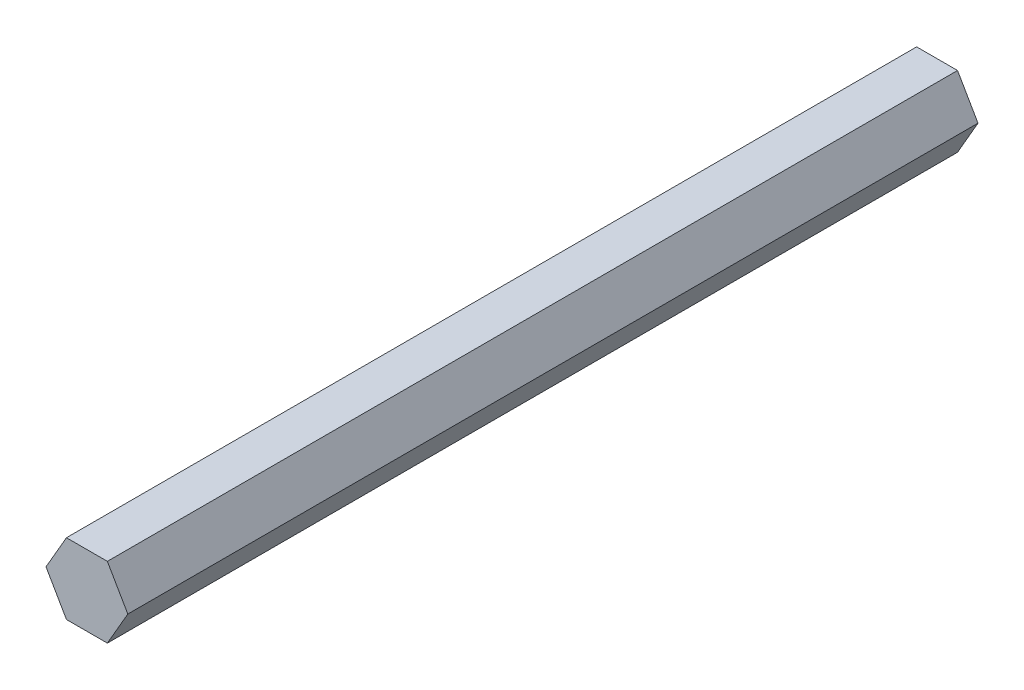
ISO-10303-21;
HEADER;
FILE_DESCRIPTION(('STEP AP214'),'2;1');
FILE_NAME('part.step','',(''),(''),'','','');
FILE_SCHEMA(('AUTOMOTIVE_DESIGN { 1 0 10303 214 1 1 1 1 }'));
ENDSEC;
DATA;
#1=APPLICATION_CONTEXT('core data for automotive mechanical design processes');
#2=APPLICATION_PROTOCOL_DEFINITION('international standard','automotive_design',2000,#1);
#3=PRODUCT_CONTEXT('',#1,'mechanical');
#4=PRODUCT('Part','Part','',(#3));
#5=PRODUCT_RELATED_PRODUCT_CATEGORY('part','',(#4));
#6=PRODUCT_DEFINITION_FORMATION('','',#4);
#7=PRODUCT_DEFINITION_CONTEXT('part definition',#1,'design');
#8=PRODUCT_DEFINITION('design','',#6,#7);
#9=PRODUCT_DEFINITION_SHAPE('','',#8);
#10=(LENGTH_UNIT() NAMED_UNIT(*) SI_UNIT(.MILLI.,.METRE.));
#11=(NAMED_UNIT(*) PLANE_ANGLE_UNIT() SI_UNIT($,.RADIAN.));
#12=(NAMED_UNIT(*) SI_UNIT($,.STERADIAN.) SOLID_ANGLE_UNIT());
#13=UNCERTAINTY_MEASURE_WITH_UNIT(LENGTH_MEASURE(1.E-05),#10,'distance_accuracy_value','');
#14=(GEOMETRIC_REPRESENTATION_CONTEXT(3) GLOBAL_UNCERTAINTY_ASSIGNED_CONTEXT((#13)) GLOBAL_UNIT_ASSIGNED_CONTEXT((#10,
#11,#12)) REPRESENTATION_CONTEXT('',''));
#15=CARTESIAN_POINT('',(0.,0.,0.));
#16=DIRECTION('',(0.,0.,1.));
#17=DIRECTION('',(1.,0.,0.));
#18=AXIS2_PLACEMENT_3D('',#15,#16,#17);
#19=CARTESIAN_POINT('',(-3.66617420935412,-6.35,76.2));
#20=DIRECTION('',(0.,1.,0.));
#21=DIRECTION('',(0.,0.,1.));
#22=AXIS2_PLACEMENT_3D('',#19,#20,#21);
#23=PLANE('',#22);
#24=DIRECTION('',(1.,0.,0.));
#25=VECTOR('',#24,1.);
#26=CARTESIAN_POINT('',(-3.66617420935412,-6.35,-76.2));
#27=LINE('',#26,#25);
#28=CARTESIAN_POINT('',(-3.66617420935412,-6.35,-76.2));
#29=VERTEX_POINT('',#28);
#30=CARTESIAN_POINT('',(3.66617420935412,-6.35,-76.2));
#31=VERTEX_POINT('',#30);
#32=EDGE_CURVE('E121',#29,#31,#27,.T.);
#33=ORIENTED_EDGE('',*,*,#32,.T.);
#34=DIRECTION('',(0.,0.,-1.));
#35=VECTOR('',#34,1.);
#36=CARTESIAN_POINT('',(3.66617420935412,-6.35,76.2));
#37=LINE('',#36,#35);
#38=CARTESIAN_POINT('',(3.66617420935412,-6.35,76.2));
#39=VERTEX_POINT('',#38);
#40=EDGE_CURVE('E11',#39,#31,#37,.T.);
#41=ORIENTED_EDGE('',*,*,#40,.F.);
#42=DIRECTION('',(1.,0.,0.));
#43=VECTOR('',#42,1.);
#44=CARTESIAN_POINT('',(-3.66617420935412,-6.35,76.2));
#45=LINE('',#44,#43);
#46=CARTESIAN_POINT('',(-3.66617420935412,-6.35,76.2));
#47=VERTEX_POINT('',#46);
#48=EDGE_CURVE('E131',#47,#39,#45,.T.);
#49=ORIENTED_EDGE('',*,*,#48,.F.);
#50=DIRECTION('',(0.,0.,-1.));
#51=VECTOR('',#50,1.);
#52=CARTESIAN_POINT('',(-3.66617420935412,-6.35,76.2));
#53=LINE('',#52,#51);
#54=EDGE_CURVE('E117',#47,#29,#53,.T.);
#55=ORIENTED_EDGE('',*,*,#54,.T.);
#56=EDGE_LOOP('',(#33,#41,#49,#55));
#57=FACE_BOUND('',#56,.T.);
#58=ADVANCED_FACE('F37',(#57),#23,.F.);
#59=CARTESIAN_POINT('',(3.66617420935412,-6.35,76.2));
#60=DIRECTION('',(-0.866025403784439,0.5,0.));
#61=DIRECTION('',(-0.5,-0.866025403784439,0.));
#62=AXIS2_PLACEMENT_3D('',#59,#60,#61);
#63=PLANE('',#62);
#64=DIRECTION('',(0.5,0.866025403784439,0.));
#65=VECTOR('',#64,1.);
#66=CARTESIAN_POINT('',(3.66617420935412,-6.35,-76.2));
#67=LINE('',#66,#65);
#68=CARTESIAN_POINT('',(7.33234841870824,0.,-76.2));
#69=VERTEX_POINT('',#68);
#70=EDGE_CURVE('E124',#31,#69,#67,.T.);
#71=ORIENTED_EDGE('',*,*,#70,.T.);
#72=DIRECTION('',(0.,0.,-1.));
#73=VECTOR('',#72,1.);
#74=CARTESIAN_POINT('',(7.33234841870824,0.,76.2));
#75=LINE('',#74,#73);
#76=CARTESIAN_POINT('',(7.33234841870824,0.,76.2));
#77=VERTEX_POINT('',#76);
#78=EDGE_CURVE('E45',#77,#69,#75,.T.);
#79=ORIENTED_EDGE('',*,*,#78,.F.);
#80=DIRECTION('',(0.5,0.866025403784439,0.));
#81=VECTOR('',#80,1.);
#82=CARTESIAN_POINT('',(3.66617420935412,-6.35,76.2));
#83=LINE('',#82,#81);
#84=EDGE_CURVE('E90',#39,#77,#83,.T.);
#85=ORIENTED_EDGE('',*,*,#84,.F.);
#86=ORIENTED_EDGE('',*,*,#40,.T.);
#87=EDGE_LOOP('',(#71,#79,#85,#86));
#88=FACE_BOUND('',#87,.T.);
#89=ADVANCED_FACE('F155',(#88),#63,.F.);
#90=CARTESIAN_POINT('',(7.33234841870824,0.,76.2));
#91=DIRECTION('',(-0.866025403784438,-0.5,0.));
#92=DIRECTION('',(0.5,-0.866025403784438,0.));
#93=AXIS2_PLACEMENT_3D('',#90,#91,#92);
#94=PLANE('',#93);
#95=DIRECTION('',(-0.5,0.866025403784438,0.));
#96=VECTOR('',#95,1.);
#97=CARTESIAN_POINT('',(7.33234841870824,0.,-76.2));
#98=LINE('',#97,#96);
#99=CARTESIAN_POINT('',(3.66617420935412,6.35,-76.2));
#100=VERTEX_POINT('',#99);
#101=EDGE_CURVE('E126',#69,#100,#98,.T.);
#102=ORIENTED_EDGE('',*,*,#101,.T.);
#103=DIRECTION('',(0.,0.,-1.));
#104=VECTOR('',#103,1.);
#105=CARTESIAN_POINT('',(3.66617420935412,6.35,76.2));
#106=LINE('',#105,#104);
#107=CARTESIAN_POINT('',(3.66617420935412,6.35,76.2));
#108=VERTEX_POINT('',#107);
#109=EDGE_CURVE('E112',#108,#100,#106,.T.);
#110=ORIENTED_EDGE('',*,*,#109,.F.);
#111=DIRECTION('',(-0.5,0.866025403784438,0.));
#112=VECTOR('',#111,1.);
#113=CARTESIAN_POINT('',(7.33234841870824,0.,76.2));
#114=LINE('',#113,#112);
#115=EDGE_CURVE('E103',#77,#108,#114,.T.);
#116=ORIENTED_EDGE('',*,*,#115,.F.);
#117=ORIENTED_EDGE('',*,*,#78,.T.);
#118=EDGE_LOOP('',(#102,#110,#116,#117));
#119=FACE_BOUND('',#118,.T.);
#120=ADVANCED_FACE('F137',(#119),#94,.F.);
#121=CARTESIAN_POINT('',(3.66617420935412,6.35,76.2));
#122=DIRECTION('',(0.,-1.,0.));
#123=DIRECTION('',(1.,0.,0.));
#124=AXIS2_PLACEMENT_3D('',#121,#122,#123);
#125=PLANE('',#124);
#126=DIRECTION('',(-1.,0.,0.));
#127=VECTOR('',#126,1.);
#128=CARTESIAN_POINT('',(3.66617420935412,6.35,-76.2));
#129=LINE('',#128,#127);
#130=CARTESIAN_POINT('',(-3.66617420935412,6.35,-76.2));
#131=VERTEX_POINT('',#130);
#132=EDGE_CURVE('E111',#100,#131,#129,.T.);
#133=ORIENTED_EDGE('',*,*,#132,.T.);
#134=DIRECTION('',(0.,0.,-1.));
#135=VECTOR('',#134,1.);
#136=CARTESIAN_POINT('',(-3.66617420935412,6.35,76.2));
#137=LINE('',#136,#135);
#138=CARTESIAN_POINT('',(-3.66617420935412,6.35,76.2));
#139=VERTEX_POINT('',#138);
#140=EDGE_CURVE('E108',#139,#131,#137,.T.);
#141=ORIENTED_EDGE('',*,*,#140,.F.);
#142=DIRECTION('',(-1.,0.,0.));
#143=VECTOR('',#142,1.);
#144=CARTESIAN_POINT('',(3.66617420935412,6.35,76.2));
#145=LINE('',#144,#143);
#146=EDGE_CURVE('E97',#108,#139,#145,.T.);
#147=ORIENTED_EDGE('',*,*,#146,.F.);
#148=ORIENTED_EDGE('',*,*,#109,.T.);
#149=EDGE_LOOP('',(#133,#141,#147,#148));
#150=FACE_BOUND('',#149,.T.);
#151=ADVANCED_FACE('F109',(#150),#125,.F.);
#152=CARTESIAN_POINT('',(-3.66617420935412,6.35,76.2));
#153=DIRECTION('',(0.866025403784439,-0.5,0.));
#154=DIRECTION('',(0.5,0.866025403784439,0.));
#155=AXIS2_PLACEMENT_3D('',#152,#153,#154);
#156=PLANE('',#155);
#157=DIRECTION('',(-0.5,-0.866025403784439,0.));
#158=VECTOR('',#157,1.);
#159=CARTESIAN_POINT('',(-3.66617420935412,6.35,-76.2));
#160=LINE('',#159,#158);
#161=CARTESIAN_POINT('',(-7.33234841870824,0.,-76.2));
#162=VERTEX_POINT('',#161);
#163=EDGE_CURVE('E76',#131,#162,#160,.T.);
#164=ORIENTED_EDGE('',*,*,#163,.T.);
#165=DIRECTION('',(0.,0.,-1.));
#166=VECTOR('',#165,1.);
#167=CARTESIAN_POINT('',(-7.33234841870824,0.,76.2));
#168=LINE('',#167,#166);
#169=CARTESIAN_POINT('',(-7.33234841870824,0.,76.2));
#170=VERTEX_POINT('',#169);
#171=EDGE_CURVE('E113',#170,#162,#168,.T.);
#172=ORIENTED_EDGE('',*,*,#171,.F.);
#173=DIRECTION('',(-0.5,-0.866025403784439,0.));
#174=VECTOR('',#173,1.);
#175=CARTESIAN_POINT('',(-3.66617420935412,6.35,76.2));
#176=LINE('',#175,#174);
#177=EDGE_CURVE('E101',#139,#170,#176,.T.);
#178=ORIENTED_EDGE('',*,*,#177,.F.);
#179=ORIENTED_EDGE('',*,*,#140,.T.);
#180=EDGE_LOOP('',(#164,#172,#178,#179));
#181=FACE_BOUND('',#180,.T.);
#182=ADVANCED_FACE('F115',(#181),#156,.F.);
#183=CARTESIAN_POINT('',(-7.33234841870824,0.,76.2));
#184=DIRECTION('',(0.866025403784438,0.5,0.));
#185=DIRECTION('',(-0.5,0.866025403784439,0.));
#186=AXIS2_PLACEMENT_3D('',#183,#184,#185);
#187=PLANE('',#186);
#188=DIRECTION('',(0.5,-0.866025403784438,0.));
#189=VECTOR('',#188,1.);
#190=CARTESIAN_POINT('',(-7.33234841870824,0.,-76.2));
#191=LINE('',#190,#189);
#192=EDGE_CURVE('E82',#162,#29,#191,.T.);
#193=ORIENTED_EDGE('',*,*,#192,.T.);
#194=ORIENTED_EDGE('',*,*,#54,.F.);
#195=DIRECTION('',(0.5,-0.866025403784438,0.));
#196=VECTOR('',#195,1.);
#197=CARTESIAN_POINT('',(-7.33234841870824,0.,76.2));
#198=LINE('',#197,#196);
#199=EDGE_CURVE('E53',#170,#47,#198,.T.);
#200=ORIENTED_EDGE('',*,*,#199,.F.);
#201=ORIENTED_EDGE('',*,*,#171,.T.);
#202=EDGE_LOOP('',(#193,#194,#200,#201));
#203=FACE_BOUND('',#202,.T.);
#204=ADVANCED_FACE('F144',(#203),#187,.F.);
#205=CARTESIAN_POINT('',(0.,0.,76.2));
#206=DIRECTION('',(0.,0.,1.));
#207=DIRECTION('',(1.,0.,0.));
#208=AXIS2_PLACEMENT_3D('',#205,#206,#207);
#209=PLANE('',#208);
#210=ORIENTED_EDGE('',*,*,#48,.T.);
#211=ORIENTED_EDGE('',*,*,#84,.T.);
#212=ORIENTED_EDGE('',*,*,#115,.T.);
#213=ORIENTED_EDGE('',*,*,#146,.T.);
#214=ORIENTED_EDGE('',*,*,#177,.T.);
#215=ORIENTED_EDGE('',*,*,#199,.T.);
#216=EDGE_LOOP('',(#210,#211,#212,#213,#214,#215));
#217=FACE_BOUND('',#216,.T.);
#218=ADVANCED_FACE('F99',(#217),#209,.T.);
#219=CARTESIAN_POINT('',(0.,0.,-76.2));
#220=DIRECTION('',(0.,0.,1.));
#221=DIRECTION('',(1.,0.,0.));
#222=AXIS2_PLACEMENT_3D('',#219,#220,#221);
#223=PLANE('',#222);
#224=ORIENTED_EDGE('',*,*,#32,.F.);
#225=ORIENTED_EDGE('',*,*,#192,.F.);
#226=ORIENTED_EDGE('',*,*,#163,.F.);
#227=ORIENTED_EDGE('',*,*,#132,.F.);
#228=ORIENTED_EDGE('',*,*,#101,.F.);
#229=ORIENTED_EDGE('',*,*,#70,.F.);
#230=EDGE_LOOP('',(#224,#225,#226,#227,#228,#229));
#231=FACE_BOUND('',#230,.T.);
#232=ADVANCED_FACE('F140',(#231),#223,.F.);
#233=CLOSED_SHELL('',(#58,#89,#120,#151,#182,#204,#218,#232));
#234=MANIFOLD_SOLID_BREP('B2',#233);
#235=ADVANCED_BREP_SHAPE_REPRESENTATION('',(#18,#234),#14);
#236=SHAPE_DEFINITION_REPRESENTATION(#9,#235);
ENDSEC;
END-ISO-10303-21;
